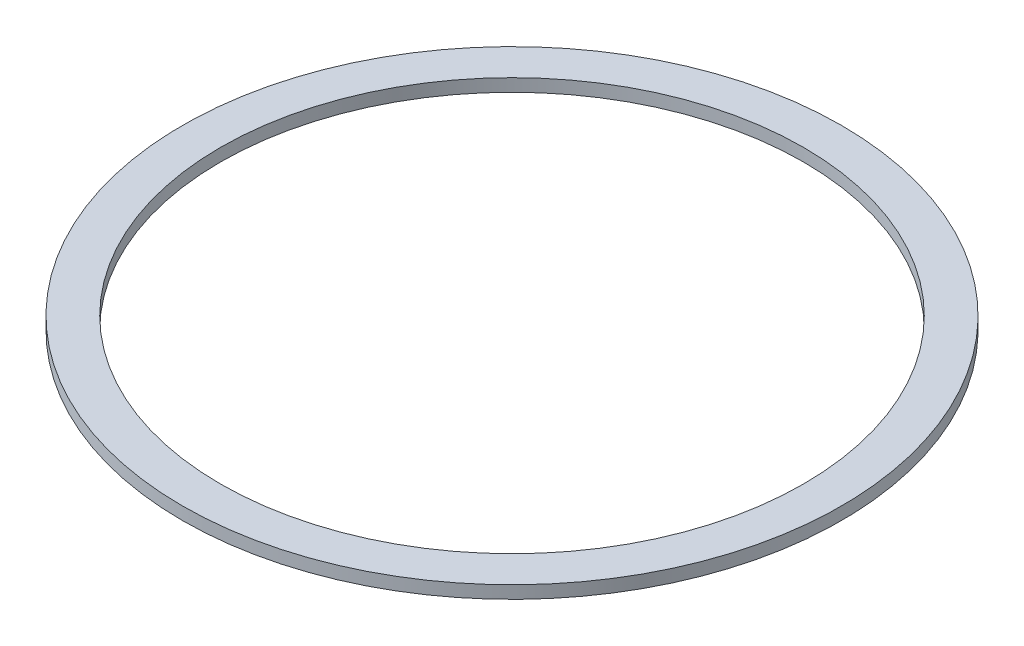
ISO-10303-21;
HEADER;
FILE_DESCRIPTION(('STEP AP214'),'2;1');
FILE_NAME('part.step','',(''),(''),'','','');
FILE_SCHEMA(('AUTOMOTIVE_DESIGN { 1 0 10303 214 1 1 1 1 }'));
ENDSEC;
DATA;
#1=APPLICATION_CONTEXT('core data for automotive mechanical design processes');
#2=APPLICATION_PROTOCOL_DEFINITION('international standard','automotive_design',2000,#1);
#3=PRODUCT_CONTEXT('',#1,'mechanical');
#4=PRODUCT('Part','Part','',(#3));
#5=PRODUCT_RELATED_PRODUCT_CATEGORY('part','',(#4));
#6=PRODUCT_DEFINITION_FORMATION('','',#4);
#7=PRODUCT_DEFINITION_CONTEXT('part definition',#1,'design');
#8=PRODUCT_DEFINITION('design','',#6,#7);
#9=PRODUCT_DEFINITION_SHAPE('','',#8);
#10=(LENGTH_UNIT() NAMED_UNIT(*) SI_UNIT(.MILLI.,.METRE.));
#11=(NAMED_UNIT(*) PLANE_ANGLE_UNIT() SI_UNIT($,.RADIAN.));
#12=(NAMED_UNIT(*) SI_UNIT($,.STERADIAN.) SOLID_ANGLE_UNIT());
#13=UNCERTAINTY_MEASURE_WITH_UNIT(LENGTH_MEASURE(1.E-05),#10,'distance_accuracy_value','');
#14=(GEOMETRIC_REPRESENTATION_CONTEXT(3) GLOBAL_UNCERTAINTY_ASSIGNED_CONTEXT((#13)) GLOBAL_UNIT_ASSIGNED_CONTEXT((#10,
#11,#12)) REPRESENTATION_CONTEXT('',''));
#15=CARTESIAN_POINT('',(0.,0.,0.));
#16=DIRECTION('',(0.,0.,1.));
#17=DIRECTION('',(1.,0.,0.));
#18=AXIS2_PLACEMENT_3D('',#15,#16,#17);
#19=CARTESIAN_POINT('',(0.,1.27,0.));
#20=DIRECTION('',(0.,1.,0.));
#21=DIRECTION('',(0.,0.,1.));
#22=AXIS2_PLACEMENT_3D('',#19,#20,#21);
#23=PLANE('',#22);
#24=CARTESIAN_POINT('',(0.,1.27,0.));
#25=DIRECTION('',(0.,1.,0.));
#26=DIRECTION('',(0.,0.,1.));
#27=AXIS2_PLACEMENT_3D('',#24,#25,#26);
#28=CIRCLE('',#27,33.02);
#29=CARTESIAN_POINT('',(0.,1.27,33.02));
#30=VERTEX_POINT('',#29);
#31=EDGE_CURVE('E10',#30,#30,#28,.T.);
#32=ORIENTED_EDGE('',*,*,#31,.T.);
#33=EDGE_LOOP('',(#32));
#34=FACE_BOUND('',#33,.T.);
#35=CARTESIAN_POINT('',(0.,1.27,0.));
#36=DIRECTION('',(0.,1.,0.));
#37=DIRECTION('',(0.,0.,1.));
#38=AXIS2_PLACEMENT_3D('',#35,#36,#37);
#39=CIRCLE('',#38,29.21);
#40=CARTESIAN_POINT('',(0.,1.27,29.21));
#41=VERTEX_POINT('',#40);
#42=EDGE_CURVE('E50',#41,#41,#39,.T.);
#43=ORIENTED_EDGE('',*,*,#42,.F.);
#44=EDGE_LOOP('',(#43));
#45=FACE_BOUND('',#44,.T.);
#46=ADVANCED_FACE('F37',(#34,#45),#23,.T.);
#47=CARTESIAN_POINT('',(0.,0.,0.));
#48=DIRECTION('',(0.,1.,0.));
#49=DIRECTION('',(0.,0.,1.));
#50=AXIS2_PLACEMENT_3D('',#47,#48,#49);
#51=PLANE('',#50);
#52=CARTESIAN_POINT('',(0.,0.,0.));
#53=DIRECTION('',(0.,1.,0.));
#54=DIRECTION('',(0.,0.,1.));
#55=AXIS2_PLACEMENT_3D('',#52,#53,#54);
#56=CIRCLE('',#55,33.02);
#57=CARTESIAN_POINT('',(0.,0.,33.02));
#58=VERTEX_POINT('',#57);
#59=EDGE_CURVE('E41',#58,#58,#56,.T.);
#60=ORIENTED_EDGE('',*,*,#59,.F.);
#61=EDGE_LOOP('',(#60));
#62=FACE_BOUND('',#61,.T.);
#63=CARTESIAN_POINT('',(0.,0.,0.));
#64=DIRECTION('',(0.,1.,0.));
#65=DIRECTION('',(0.,0.,1.));
#66=AXIS2_PLACEMENT_3D('',#63,#64,#65);
#67=CIRCLE('',#66,29.21);
#68=CARTESIAN_POINT('',(0.,0.,29.21));
#69=VERTEX_POINT('',#68);
#70=EDGE_CURVE('E52',#69,#69,#67,.T.);
#71=ORIENTED_EDGE('',*,*,#70,.T.);
#72=EDGE_LOOP('',(#71));
#73=FACE_BOUND('',#72,.T.);
#74=ADVANCED_FACE('F64',(#62,#73),#51,.F.);
#75=CARTESIAN_POINT('',(0.,1.27,0.));
#76=DIRECTION('',(0.,-1.,0.));
#77=DIRECTION('',(0.,0.,-1.));
#78=AXIS2_PLACEMENT_3D('',#75,#76,#77);
#79=CYLINDRICAL_SURFACE('',#78,33.02);
#80=ORIENTED_EDGE('',*,*,#31,.F.);
#81=EDGE_LOOP('',(#80));
#82=FACE_BOUND('',#81,.T.);
#83=ORIENTED_EDGE('',*,*,#59,.T.);
#84=EDGE_LOOP('',(#83));
#85=FACE_BOUND('',#84,.T.);
#86=ADVANCED_FACE('F39',(#82,#85),#79,.T.);
#87=CARTESIAN_POINT('',(0.,1.27,0.));
#88=DIRECTION('',(0.,-1.,0.));
#89=DIRECTION('',(0.,0.,-1.));
#90=AXIS2_PLACEMENT_3D('',#87,#88,#89);
#91=CYLINDRICAL_SURFACE('',#90,29.21);
#92=ORIENTED_EDGE('',*,*,#42,.T.);
#93=EDGE_LOOP('',(#92));
#94=FACE_BOUND('',#93,.T.);
#95=ORIENTED_EDGE('',*,*,#70,.F.);
#96=EDGE_LOOP('',(#95));
#97=FACE_BOUND('',#96,.T.);
#98=ADVANCED_FACE('F60',(#94,#97),#91,.F.);
#99=CLOSED_SHELL('',(#46,#74,#86,#98));
#100=MANIFOLD_SOLID_BREP('B2',#99);
#101=ADVANCED_BREP_SHAPE_REPRESENTATION('',(#18,#100),#14);
#102=SHAPE_DEFINITION_REPRESENTATION(#9,#101);
ENDSEC;
END-ISO-10303-21;
